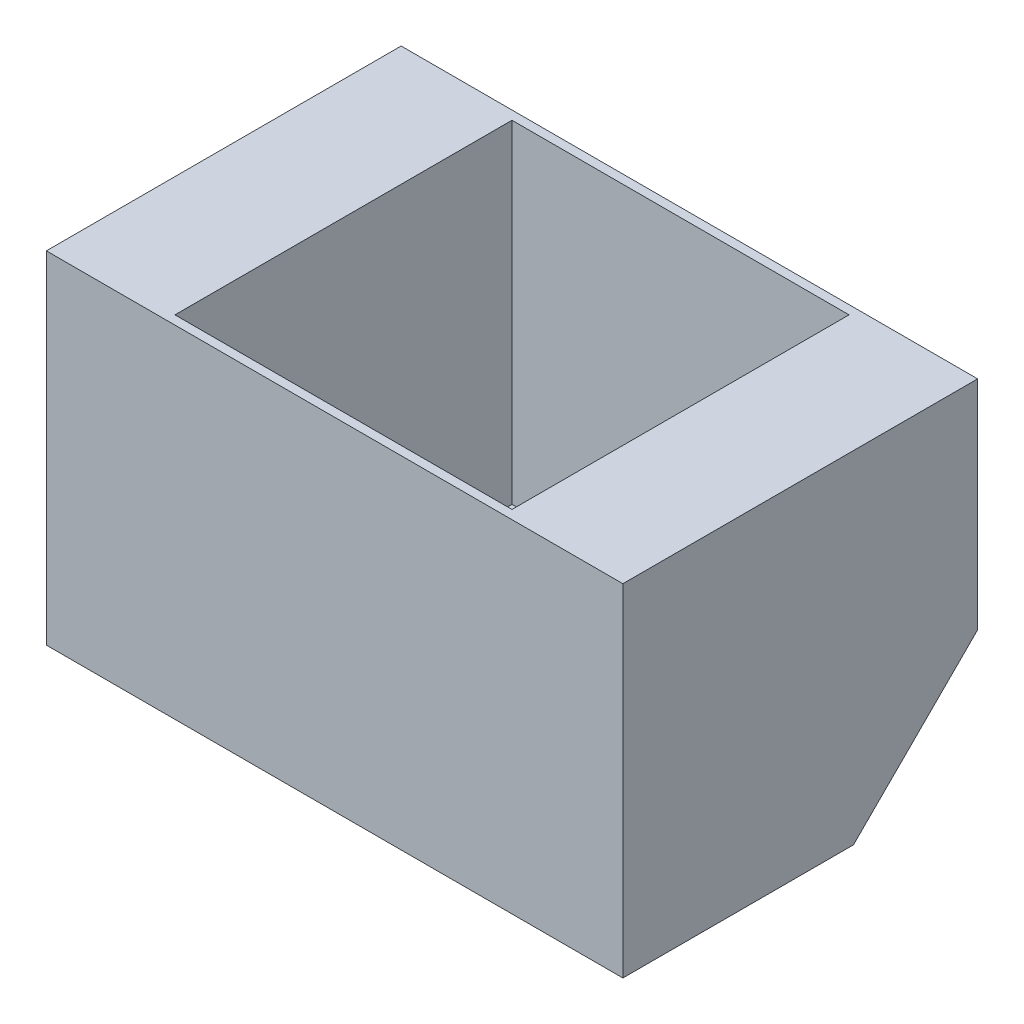
ISO-10303-21;
HEADER;
FILE_DESCRIPTION(('STEP AP214'),'2;1');
FILE_NAME('part.step','',(''),(''),'','','');
FILE_SCHEMA(('AUTOMOTIVE_DESIGN { 1 0 10303 214 1 1 1 1 }'));
ENDSEC;
DATA;
#1=APPLICATION_CONTEXT('core data for automotive mechanical design processes');
#2=APPLICATION_PROTOCOL_DEFINITION('international standard','automotive_design',2000,#1);
#3=PRODUCT_CONTEXT('',#1,'mechanical');
#4=PRODUCT('Part','Part','',(#3));
#5=PRODUCT_RELATED_PRODUCT_CATEGORY('part','',(#4));
#6=PRODUCT_DEFINITION_FORMATION('','',#4);
#7=PRODUCT_DEFINITION_CONTEXT('part definition',#1,'design');
#8=PRODUCT_DEFINITION('design','',#6,#7);
#9=PRODUCT_DEFINITION_SHAPE('','',#8);
#10=(LENGTH_UNIT() NAMED_UNIT(*) SI_UNIT(.MILLI.,.METRE.));
#11=(NAMED_UNIT(*) PLANE_ANGLE_UNIT() SI_UNIT($,.RADIAN.));
#12=(NAMED_UNIT(*) SI_UNIT($,.STERADIAN.) SOLID_ANGLE_UNIT());
#13=UNCERTAINTY_MEASURE_WITH_UNIT(LENGTH_MEASURE(1.E-05),#10,'distance_accuracy_value','');
#14=(GEOMETRIC_REPRESENTATION_CONTEXT(3) GLOBAL_UNCERTAINTY_ASSIGNED_CONTEXT((#13)) GLOBAL_UNIT_ASSIGNED_CONTEXT((#10,
#11,#12)) REPRESENTATION_CONTEXT('',''));
#15=CARTESIAN_POINT('',(0.,0.,0.));
#16=DIRECTION('',(0.,0.,1.));
#17=DIRECTION('',(1.,0.,0.));
#18=AXIS2_PLACEMENT_3D('',#15,#16,#17);
#19=CARTESIAN_POINT('',(0.,0.,0.));
#20=DIRECTION('',(0.,1.,0.));
#21=DIRECTION('',(0.,0.,1.));
#22=AXIS2_PLACEMENT_3D('',#19,#20,#21);
#23=PLANE('',#22);
#24=CARTESIAN_POINT('',(0.,0.,0.));
#25=DIRECTION('',(0.,1.,0.));
#26=DIRECTION('',(0.,0.,1.));
#27=AXIS2_PLACEMENT_3D('',#24,#25,#26);
#28=CIRCLE('',#27,18.4);
#29=CARTESIAN_POINT('',(0.,0.,18.4));
#30=VERTEX_POINT('',#29);
#31=EDGE_CURVE('E165',#30,#30,#28,.T.);
#32=ORIENTED_EDGE('',*,*,#31,.T.);
#33=EDGE_LOOP('',(#32));
#34=FACE_BOUND('',#33,.T.);
#35=CARTESIAN_POINT('',(24.,0.,-24.));
#36=DIRECTION('',(0.,1.,0.));
#37=DIRECTION('',(0.,0.,1.));
#38=AXIS2_PLACEMENT_3D('',#35,#36,#37);
#39=CIRCLE('',#38,2.2);
#40=CARTESIAN_POINT('',(24.,0.,-21.8));
#41=VERTEX_POINT('',#40);
#42=EDGE_CURVE('E169',#41,#41,#39,.T.);
#43=ORIENTED_EDGE('',*,*,#42,.T.);
#44=EDGE_LOOP('',(#43));
#45=FACE_BOUND('',#44,.T.);
#46=CARTESIAN_POINT('',(-24.,0.,-24.));
#47=DIRECTION('',(0.,1.,0.));
#48=DIRECTION('',(0.,0.,1.));
#49=AXIS2_PLACEMENT_3D('',#46,#47,#48);
#50=CIRCLE('',#49,2.2);
#51=CARTESIAN_POINT('',(-24.,0.,-21.8));
#52=VERTEX_POINT('',#51);
#53=EDGE_CURVE('E173',#52,#52,#50,.T.);
#54=ORIENTED_EDGE('',*,*,#53,.T.);
#55=EDGE_LOOP('',(#54));
#56=FACE_BOUND('',#55,.T.);
#57=CARTESIAN_POINT('',(24.,0.,24.));
#58=DIRECTION('',(0.,1.,0.));
#59=DIRECTION('',(0.,0.,1.));
#60=AXIS2_PLACEMENT_3D('',#57,#58,#59);
#61=CIRCLE('',#60,2.2);
#62=CARTESIAN_POINT('',(24.,0.,26.2));
#63=VERTEX_POINT('',#62);
#64=EDGE_CURVE('E177',#63,#63,#61,.F.);
#65=ORIENTED_EDGE('',*,*,#64,.F.);
#66=EDGE_LOOP('',(#65));
#67=FACE_BOUND('',#66,.T.);
#68=CARTESIAN_POINT('',(-24.,0.,24.));
#69=DIRECTION('',(0.,1.,0.));
#70=DIRECTION('',(0.,0.,1.));
#71=AXIS2_PLACEMENT_3D('',#68,#69,#70);
#72=CIRCLE('',#71,2.2);
#73=CARTESIAN_POINT('',(-24.,0.,26.2));
#74=VERTEX_POINT('',#73);
#75=EDGE_CURVE('E51',#74,#74,#72,.F.);
#76=ORIENTED_EDGE('',*,*,#75,.F.);
#77=EDGE_LOOP('',(#76));
#78=FACE_BOUND('',#77,.T.);
#79=DIRECTION('',(-1.,0.,0.));
#80=VECTOR('',#79,1.);
#81=CARTESIAN_POINT('',(-44.0000000000001,0.,-12.));
#82=LINE('',#81,#80);
#83=CARTESIAN_POINT('',(-44.0000000000001,0.,-12.));
#84=VERTEX_POINT('',#83);
#85=CARTESIAN_POINT('',(-65.,0.,-12.));
#86=VERTEX_POINT('',#85);
#87=EDGE_CURVE('E65',#84,#86,#82,.T.);
#88=ORIENTED_EDGE('',*,*,#87,.F.);
#89=DIRECTION('',(0.,0.,-1.));
#90=VECTOR('',#89,1.);
#91=CARTESIAN_POINT('',(-44.0000000000001,0.,0.));
#92=LINE('',#91,#90);
#93=CARTESIAN_POINT('',(-44.0000000000001,0.,-40.));
#94=VERTEX_POINT('',#93);
#95=EDGE_CURVE('E142',#84,#94,#92,.T.);
#96=ORIENTED_EDGE('',*,*,#95,.T.);
#97=DIRECTION('',(-1.,0.,0.));
#98=VECTOR('',#97,1.);
#99=CARTESIAN_POINT('',(-40.,0.,-40.));
#100=LINE('',#99,#98);
#101=CARTESIAN_POINT('',(44.0000000000001,0.,-40.));
#102=VERTEX_POINT('',#101);
#103=EDGE_CURVE('E57',#102,#94,#100,.T.);
#104=ORIENTED_EDGE('',*,*,#103,.F.);
#105=DIRECTION('',(0.,0.,-1.));
#106=VECTOR('',#105,1.);
#107=CARTESIAN_POINT('',(44.0000000000001,0.,0.));
#108=LINE('',#107,#106);
#109=CARTESIAN_POINT('',(44.0000000000001,0.,-12.));
#110=VERTEX_POINT('',#109);
#111=EDGE_CURVE('E370',#110,#102,#108,.T.);
#112=ORIENTED_EDGE('',*,*,#111,.F.);
#113=DIRECTION('',(1.,0.,0.));
#114=VECTOR('',#113,1.);
#115=CARTESIAN_POINT('',(44.0000000000001,0.,-12.));
#116=LINE('',#115,#114);
#117=CARTESIAN_POINT('',(65.,0.,-12.));
#118=VERTEX_POINT('',#117);
#119=EDGE_CURVE('E279',#110,#118,#116,.T.);
#120=ORIENTED_EDGE('',*,*,#119,.T.);
#121=DIRECTION('',(0.,0.,1.));
#122=VECTOR('',#121,1.);
#123=CARTESIAN_POINT('',(65.,0.,-40.));
#124=LINE('',#123,#122);
#125=CARTESIAN_POINT('',(65.,0.,40.));
#126=VERTEX_POINT('',#125);
#127=EDGE_CURVE('E274',#118,#126,#124,.T.);
#128=ORIENTED_EDGE('',*,*,#127,.T.);
#129=DIRECTION('',(1.,0.,0.));
#130=VECTOR('',#129,1.);
#131=CARTESIAN_POINT('',(-40.,0.,40.));
#132=LINE('',#131,#130);
#133=CARTESIAN_POINT('',(-65.,0.,40.));
#134=VERTEX_POINT('',#133);
#135=EDGE_CURVE('E11',#134,#126,#132,.T.);
#136=ORIENTED_EDGE('',*,*,#135,.F.);
#137=DIRECTION('',(0.,0.,1.));
#138=VECTOR('',#137,1.);
#139=CARTESIAN_POINT('',(-65.,0.,-40.));
#140=LINE('',#139,#138);
#141=EDGE_CURVE('E298',#86,#134,#140,.T.);
#142=ORIENTED_EDGE('',*,*,#141,.F.);
#143=EDGE_LOOP('',(#88,#96,#104,#112,#120,#128,#136,#142));
#144=FACE_BOUND('',#143,.T.);
#145=ADVANCED_FACE('F47',(#34,#45,#56,#67,#78,#144),#23,.F.);
#146=CARTESIAN_POINT('',(-40.,2.,-40.));
#147=DIRECTION('',(0.,0.,1.));
#148=DIRECTION('',(1.,0.,0.));
#149=AXIS2_PLACEMENT_3D('',#146,#147,#148);
#150=PLANE('',#149);
#151=DIRECTION('',(-1.,0.,0.));
#152=VECTOR('',#151,1.);
#153=CARTESIAN_POINT('',(-44.0000000000001,28.,-40.));
#154=LINE('',#153,#152);
#155=CARTESIAN_POINT('',(-44.0000000000001,28.,-40.));
#156=VERTEX_POINT('',#155);
#157=CARTESIAN_POINT('',(-65.,28.,-40.));
#158=VERTEX_POINT('',#157);
#159=EDGE_CURVE('E358',#156,#158,#154,.T.);
#160=ORIENTED_EDGE('',*,*,#159,.T.);
#161=DIRECTION('',(0.,1.,0.));
#162=VECTOR('',#161,1.);
#163=CARTESIAN_POINT('',(-65.,0.,-40.));
#164=LINE('',#163,#162);
#165=CARTESIAN_POINT('',(-65.,77.,-40.));
#166=VERTEX_POINT('',#165);
#167=EDGE_CURVE('E292',#158,#166,#164,.T.);
#168=ORIENTED_EDGE('',*,*,#167,.T.);
#169=DIRECTION('',(-1.,0.,0.));
#170=VECTOR('',#169,1.);
#171=CARTESIAN_POINT('',(-40.,77.,-40.));
#172=LINE('',#171,#170);
#173=CARTESIAN_POINT('',(65.,77.,-40.));
#174=VERTEX_POINT('',#173);
#175=EDGE_CURVE('E194',#174,#166,#172,.T.);
#176=ORIENTED_EDGE('',*,*,#175,.F.);
#177=DIRECTION('',(0.,1.,0.));
#178=VECTOR('',#177,1.);
#179=CARTESIAN_POINT('',(65.,0.,-40.));
#180=LINE('',#179,#178);
#181=CARTESIAN_POINT('',(65.,28.,-40.));
#182=VERTEX_POINT('',#181);
#183=EDGE_CURVE('E278',#182,#174,#180,.T.);
#184=ORIENTED_EDGE('',*,*,#183,.F.);
#185=DIRECTION('',(1.,0.,0.));
#186=VECTOR('',#185,1.);
#187=CARTESIAN_POINT('',(44.0000000000001,28.,-40.));
#188=LINE('',#187,#186);
#189=CARTESIAN_POINT('',(44.0000000000001,28.,-40.));
#190=VERTEX_POINT('',#189);
#191=EDGE_CURVE('E73',#190,#182,#188,.T.);
#192=ORIENTED_EDGE('',*,*,#191,.F.);
#193=DIRECTION('',(0.,1.,0.));
#194=VECTOR('',#193,1.);
#195=CARTESIAN_POINT('',(44.0000000000001,0.,-40.));
#196=LINE('',#195,#194);
#197=EDGE_CURVE('E159',#102,#190,#196,.T.);
#198=ORIENTED_EDGE('',*,*,#197,.F.);
#199=ORIENTED_EDGE('',*,*,#103,.T.);
#200=DIRECTION('',(0.,1.,0.));
#201=VECTOR('',#200,1.);
#202=CARTESIAN_POINT('',(-44.0000000000001,0.,-40.));
#203=LINE('',#202,#201);
#204=EDGE_CURVE('E139',#94,#156,#203,.T.);
#205=ORIENTED_EDGE('',*,*,#204,.T.);
#206=EDGE_LOOP('',(#160,#168,#176,#184,#192,#198,#199,#205));
#207=FACE_BOUND('',#206,.T.);
#208=ADVANCED_FACE('F49',(#207),#150,.F.);
#209=CARTESIAN_POINT('',(-65.,0.,-40.));
#210=DIRECTION('',(1.,0.,0.));
#211=DIRECTION('',(0.,0.,-1.));
#212=AXIS2_PLACEMENT_3D('',#209,#210,#211);
#213=PLANE('',#212);
#214=DIRECTION('',(0.,-0.707106781186548,0.707106781186547));
#215=VECTOR('',#214,1.);
#216=CARTESIAN_POINT('',(-65.,-6.00000000000001,-6.));
#217=LINE('',#216,#215);
#218=EDGE_CURVE('E149',#158,#86,#217,.T.);
#219=ORIENTED_EDGE('',*,*,#218,.T.);
#220=ORIENTED_EDGE('',*,*,#141,.T.);
#221=DIRECTION('',(0.,1.,0.));
#222=VECTOR('',#221,1.);
#223=CARTESIAN_POINT('',(-65.,0.,40.));
#224=LINE('',#223,#222);
#225=CARTESIAN_POINT('',(-65.,77.,40.));
#226=VERTEX_POINT('',#225);
#227=EDGE_CURVE('E269',#134,#226,#224,.T.);
#228=ORIENTED_EDGE('',*,*,#227,.T.);
#229=DIRECTION('',(0.,0.,1.));
#230=VECTOR('',#229,1.);
#231=CARTESIAN_POINT('',(-65.,77.,-40.));
#232=LINE('',#231,#230);
#233=EDGE_CURVE('E295',#166,#226,#232,.T.);
#234=ORIENTED_EDGE('',*,*,#233,.F.);
#235=ORIENTED_EDGE('',*,*,#167,.F.);
#236=EDGE_LOOP('',(#219,#220,#228,#234,#235));
#237=FACE_BOUND('',#236,.T.);
#238=ADVANCED_FACE('F213',(#237),#213,.F.);
#239=CARTESIAN_POINT('',(0.,2.,0.));
#240=DIRECTION('',(0.,1.,0.));
#241=DIRECTION('',(0.,0.,1.));
#242=AXIS2_PLACEMENT_3D('',#239,#240,#241);
#243=PLANE('',#242);
#244=DIRECTION('',(0.,0.,1.));
#245=VECTOR('',#244,1.);
#246=CARTESIAN_POINT('',(-38.,2.,-38.));
#247=LINE('',#246,#245);
#248=CARTESIAN_POINT('',(-38.,2.,-38.));
#249=VERTEX_POINT('',#248);
#250=CARTESIAN_POINT('',(-38.,2.,38.));
#251=VERTEX_POINT('',#250);
#252=EDGE_CURVE('E301',#249,#251,#247,.T.);
#253=ORIENTED_EDGE('',*,*,#252,.T.);
#254=DIRECTION('',(1.,0.,0.));
#255=VECTOR('',#254,1.);
#256=CARTESIAN_POINT('',(38.,2.,38.));
#257=LINE('',#256,#255);
#258=CARTESIAN_POINT('',(38.,2.,38.));
#259=VERTEX_POINT('',#258);
#260=EDGE_CURVE('E322',#251,#259,#257,.T.);
#261=ORIENTED_EDGE('',*,*,#260,.T.);
#262=DIRECTION('',(0.,0.,-1.));
#263=VECTOR('',#262,1.);
#264=CARTESIAN_POINT('',(38.,2.,-38.));
#265=LINE('',#264,#263);
#266=CARTESIAN_POINT('',(38.,2.,-38.));
#267=VERTEX_POINT('',#266);
#268=EDGE_CURVE('E325',#259,#267,#265,.T.);
#269=ORIENTED_EDGE('',*,*,#268,.T.);
#270=DIRECTION('',(-1.,0.,0.));
#271=VECTOR('',#270,1.);
#272=CARTESIAN_POINT('',(38.,2.,-38.));
#273=LINE('',#272,#271);
#274=EDGE_CURVE('E309',#267,#249,#273,.T.);
#275=ORIENTED_EDGE('',*,*,#274,.T.);
#276=EDGE_LOOP('',(#253,#261,#269,#275));
#277=FACE_BOUND('',#276,.T.);
#278=CARTESIAN_POINT('',(-24.,2.,24.));
#279=DIRECTION('',(0.,-1.,0.));
#280=DIRECTION('',(0.,0.,-1.));
#281=AXIS2_PLACEMENT_3D('',#278,#279,#280);
#282=CIRCLE('',#281,2.2);
#283=CARTESIAN_POINT('',(-24.,2.,26.2));
#284=VERTEX_POINT('',#283);
#285=EDGE_CURVE('E180',#284,#284,#282,.T.);
#286=ORIENTED_EDGE('',*,*,#285,.T.);
#287=EDGE_LOOP('',(#286));
#288=FACE_BOUND('',#287,.T.);
#289=CARTESIAN_POINT('',(24.,2.,24.));
#290=DIRECTION('',(0.,-1.,0.));
#291=DIRECTION('',(0.,0.,-1.));
#292=AXIS2_PLACEMENT_3D('',#289,#290,#291);
#293=CIRCLE('',#292,2.2);
#294=CARTESIAN_POINT('',(24.,2.,26.2));
#295=VERTEX_POINT('',#294);
#296=EDGE_CURVE('E188',#295,#295,#293,.T.);
#297=ORIENTED_EDGE('',*,*,#296,.T.);
#298=EDGE_LOOP('',(#297));
#299=FACE_BOUND('',#298,.T.);
#300=CARTESIAN_POINT('',(-24.,2.,-24.));
#301=DIRECTION('',(0.,1.,0.));
#302=DIRECTION('',(0.,0.,1.));
#303=AXIS2_PLACEMENT_3D('',#300,#301,#302);
#304=CIRCLE('',#303,2.2);
#305=CARTESIAN_POINT('',(-24.,2.,-21.8));
#306=VERTEX_POINT('',#305);
#307=EDGE_CURVE('E174',#306,#306,#304,.T.);
#308=ORIENTED_EDGE('',*,*,#307,.F.);
#309=EDGE_LOOP('',(#308));
#310=FACE_BOUND('',#309,.T.);
#311=CARTESIAN_POINT('',(24.,2.,-24.));
#312=DIRECTION('',(0.,1.,0.));
#313=DIRECTION('',(0.,0.,1.));
#314=AXIS2_PLACEMENT_3D('',#311,#312,#313);
#315=CIRCLE('',#314,2.2);
#316=CARTESIAN_POINT('',(24.,2.,-21.8));
#317=VERTEX_POINT('',#316);
#318=EDGE_CURVE('E186',#317,#317,#315,.T.);
#319=ORIENTED_EDGE('',*,*,#318,.F.);
#320=EDGE_LOOP('',(#319));
#321=FACE_BOUND('',#320,.T.);
#322=CARTESIAN_POINT('',(0.,2.,0.));
#323=DIRECTION('',(0.,1.,0.));
#324=DIRECTION('',(0.,0.,1.));
#325=AXIS2_PLACEMENT_3D('',#322,#323,#324);
#326=CIRCLE('',#325,18.4);
#327=CARTESIAN_POINT('',(0.,2.,18.4));
#328=VERTEX_POINT('',#327);
#329=EDGE_CURVE('E161',#328,#328,#326,.T.);
#330=ORIENTED_EDGE('',*,*,#329,.F.);
#331=EDGE_LOOP('',(#330));
#332=FACE_BOUND('',#331,.T.);
#333=ADVANCED_FACE('F209',(#277,#288,#299,#310,#321,#332),#243,.T.);
#334=CARTESIAN_POINT('',(-40.,2.,40.));
#335=DIRECTION('',(0.,0.,-1.));
#336=DIRECTION('',(-1.,0.,0.));
#337=AXIS2_PLACEMENT_3D('',#334,#335,#336);
#338=PLANE('',#337);
#339=ORIENTED_EDGE('',*,*,#135,.T.);
#340=DIRECTION('',(0.,1.,0.));
#341=VECTOR('',#340,1.);
#342=CARTESIAN_POINT('',(65.,0.,40.));
#343=LINE('',#342,#341);
#344=CARTESIAN_POINT('',(65.,77.,40.));
#345=VERTEX_POINT('',#344);
#346=EDGE_CURVE('E267',#126,#345,#343,.T.);
#347=ORIENTED_EDGE('',*,*,#346,.T.);
#348=DIRECTION('',(1.,0.,0.));
#349=VECTOR('',#348,1.);
#350=CARTESIAN_POINT('',(-40.,77.,40.));
#351=LINE('',#350,#349);
#352=EDGE_CURVE('E344',#226,#345,#351,.T.);
#353=ORIENTED_EDGE('',*,*,#352,.F.);
#354=ORIENTED_EDGE('',*,*,#227,.F.);
#355=EDGE_LOOP('',(#339,#347,#353,#354));
#356=FACE_BOUND('',#355,.T.);
#357=ADVANCED_FACE('F212',(#356),#338,.F.);
#358=CARTESIAN_POINT('',(0.,2.,0.));
#359=DIRECTION('',(0.,-1.,0.));
#360=DIRECTION('',(0.,0.,-1.));
#361=AXIS2_PLACEMENT_3D('',#358,#359,#360);
#362=CYLINDRICAL_SURFACE('',#361,18.4);
#363=ORIENTED_EDGE('',*,*,#329,.T.);
#364=EDGE_LOOP('',(#363));
#365=FACE_BOUND('',#364,.T.);
#366=ORIENTED_EDGE('',*,*,#31,.F.);
#367=EDGE_LOOP('',(#366));
#368=FACE_BOUND('',#367,.T.);
#369=ADVANCED_FACE('F218',(#365,#368),#362,.F.);
#370=CARTESIAN_POINT('',(24.,-13.25,-24.));
#371=DIRECTION('',(0.,1.,0.));
#372=DIRECTION('',(0.,0.,1.));
#373=AXIS2_PLACEMENT_3D('',#370,#371,#372);
#374=CYLINDRICAL_SURFACE('',#373,2.2);
#375=CARTESIAN_POINT('',(24.,2.,-21.8));
#376=CARTESIAN_POINT('',(24.,1.97916666666667,-21.8));
#377=CARTESIAN_POINT('',(24.,1.95833333333333,-21.8));
#378=CARTESIAN_POINT('',(24.,1.91666666666666,-21.8));
#379=CARTESIAN_POINT('',(24.,1.89583333333333,-21.8));
#380=CARTESIAN_POINT('',(24.,1.85416666666666,-21.8));
#381=CARTESIAN_POINT('',(24.,1.83333333333333,-21.8));
#382=CARTESIAN_POINT('',(24.,1.79166666666666,-21.8));
#383=CARTESIAN_POINT('',(24.,1.77083333333333,-21.8));
#384=CARTESIAN_POINT('',(24.,1.72916666666666,-21.8));
#385=CARTESIAN_POINT('',(24.,1.70833333333333,-21.8));
#386=CARTESIAN_POINT('',(24.,1.66666666666666,-21.8));
#387=CARTESIAN_POINT('',(24.,1.64583333333333,-21.8));
#388=CARTESIAN_POINT('',(24.,1.60416666666666,-21.8));
#389=CARTESIAN_POINT('',(24.,1.58333333333333,-21.8));
#390=CARTESIAN_POINT('',(24.,1.54166666666666,-21.8));
#391=CARTESIAN_POINT('',(24.,1.52083333333333,-21.8));
#392=CARTESIAN_POINT('',(24.,1.47916666666667,-21.8));
#393=CARTESIAN_POINT('',(24.,1.45833333333333,-21.8));
#394=CARTESIAN_POINT('',(24.,1.41666666666667,-21.8));
#395=CARTESIAN_POINT('',(24.,1.39583333333333,-21.8));
#396=CARTESIAN_POINT('',(24.,1.35416666666667,-21.8));
#397=CARTESIAN_POINT('',(24.,1.33333333333333,-21.8));
#398=CARTESIAN_POINT('',(24.,1.29166666666667,-21.8));
#399=CARTESIAN_POINT('',(24.,1.27083333333333,-21.8));
#400=CARTESIAN_POINT('',(24.,1.22916666666667,-21.8));
#401=CARTESIAN_POINT('',(24.,1.20833333333333,-21.8));
#402=CARTESIAN_POINT('',(24.,1.16666666666667,-21.8));
#403=CARTESIAN_POINT('',(24.,1.14583333333333,-21.8));
#404=CARTESIAN_POINT('',(24.,1.10416666666667,-21.8));
#405=CARTESIAN_POINT('',(24.,1.08333333333333,-21.8));
#406=CARTESIAN_POINT('',(24.,1.04166666666667,-21.8));
#407=CARTESIAN_POINT('',(24.,1.02083333333333,-21.8));
#408=CARTESIAN_POINT('',(24.,0.979166666666666,-21.8));
#409=CARTESIAN_POINT('',(24.,0.958333333333332,-21.8));
#410=CARTESIAN_POINT('',(24.,0.916666666666666,-21.8));
#411=CARTESIAN_POINT('',(24.,0.895833333333332,-21.8));
#412=CARTESIAN_POINT('',(24.,0.854166666666666,-21.8));
#413=CARTESIAN_POINT('',(24.,0.833333333333332,-21.8));
#414=CARTESIAN_POINT('',(24.,0.791666666666666,-21.8));
#415=CARTESIAN_POINT('',(24.,0.770833333333332,-21.8));
#416=CARTESIAN_POINT('',(24.,0.729166666666666,-21.8));
#417=CARTESIAN_POINT('',(24.,0.708333333333332,-21.8));
#418=CARTESIAN_POINT('',(24.,0.666666666666666,-21.8));
#419=CARTESIAN_POINT('',(24.,0.645833333333332,-21.8));
#420=CARTESIAN_POINT('',(24.,0.604166666666666,-21.8));
#421=CARTESIAN_POINT('',(24.,0.583333333333333,-21.8));
#422=CARTESIAN_POINT('',(24.,0.541666666666667,-21.8));
#423=CARTESIAN_POINT('',(24.,0.520833333333334,-21.8));
#424=CARTESIAN_POINT('',(24.,0.479166666666667,-21.8));
#425=CARTESIAN_POINT('',(24.,0.458333333333334,-21.8));
#426=CARTESIAN_POINT('',(24.,0.416666666666667,-21.8));
#427=CARTESIAN_POINT('',(24.,0.395833333333334,-21.8));
#428=CARTESIAN_POINT('',(24.,0.354166666666667,-21.8));
#429=CARTESIAN_POINT('',(24.,0.333333333333334,-21.8));
#430=CARTESIAN_POINT('',(24.,0.291666666666667,-21.8));
#431=CARTESIAN_POINT('',(24.,0.270833333333334,-21.8));
#432=CARTESIAN_POINT('',(24.,0.229166666666667,-21.8));
#433=CARTESIAN_POINT('',(24.,0.208333333333334,-21.8));
#434=CARTESIAN_POINT('',(24.,0.166666666666667,-21.8));
#435=CARTESIAN_POINT('',(24.,0.145833333333333,-21.8));
#436=CARTESIAN_POINT('',(24.,0.104166666666667,-21.8));
#437=CARTESIAN_POINT('',(24.,0.0833333333333334,-21.8));
#438=CARTESIAN_POINT('',(24.,0.0416666666666667,-21.8));
#439=CARTESIAN_POINT('',(24.,0.0208333333333333,-21.8));
#440=CARTESIAN_POINT('',(24.,0.,-21.8));
#441=B_SPLINE_CURVE_WITH_KNOTS('',3,(#375,#376,#377,#378,#379,#380,#381,#382,#383,#384,#385,
#386,#387,#388,#389,#390,#391,#392,#393,#394,#395,#396,#397,#398,#399,#400,#401,#402,#403,#404,
#405,#406,#407,#408,#409,#410,#411,#412,#413,#414,#415,#416,#417,#418,#419,#420,#421,#422,#423,
#424,#425,#426,#427,#428,#429,#430,#431,#432,#433,#434,#435,#436,#437,#438,#439,#440),
.UNSPECIFIED.,.F.,.F.,(4,2,2,2,2,2,2,2,2,2,2,2,2,2,2,2,2,2,2,2,2,2,2,2,2,2,2,2,2,2,2,2,4),(0.,
0.0625000000000001,0.125,0.1875,0.25,0.3125,0.375,0.4375,0.5,0.562499999999999,
0.624999999999999,0.687499999999999,0.749999999999999,0.812499999999999,0.874999999999999,
0.937499999999999,0.999999999999999,1.0625,1.125,1.1875,1.25,1.3125,1.375,1.4375,1.5,1.5625,
1.625,1.6875,1.75,1.8125,1.875,1.9375,2.),.UNSPECIFIED.);
#442=EDGE_CURVE('BSEAM206',#317,#41,#441,.T.);
#443=ORIENTED_EDGE('',*,*,#318,.T.);
#444=ORIENTED_EDGE('',*,*,#42,.F.);
#445=ORIENTED_EDGE('',*,*,#442,.T.);
#446=ORIENTED_EDGE('',*,*,#442,.F.);
#447=EDGE_LOOP('',(#443,#445,#444,#446));
#448=FACE_BOUND('',#447,.T.);
#449=ADVANCED_FACE('F206',(#448),#374,.F.);
#450=CARTESIAN_POINT('',(-24.,-13.25,-24.));
#451=DIRECTION('',(0.,1.,0.));
#452=DIRECTION('',(0.,0.,1.));
#453=AXIS2_PLACEMENT_3D('',#450,#451,#452);
#454=CYLINDRICAL_SURFACE('',#453,2.2);
#455=CARTESIAN_POINT('',(-24.,2.,-21.8));
#456=CARTESIAN_POINT('',(-24.,1.97916666666667,-21.8));
#457=CARTESIAN_POINT('',(-24.,1.95833333333333,-21.8));
#458=CARTESIAN_POINT('',(-24.,1.91666666666666,-21.8));
#459=CARTESIAN_POINT('',(-24.,1.89583333333333,-21.8));
#460=CARTESIAN_POINT('',(-24.,1.85416666666666,-21.8));
#461=CARTESIAN_POINT('',(-24.,1.83333333333333,-21.8));
#462=CARTESIAN_POINT('',(-24.,1.79166666666666,-21.8));
#463=CARTESIAN_POINT('',(-24.,1.77083333333333,-21.8));
#464=CARTESIAN_POINT('',(-24.,1.72916666666666,-21.8));
#465=CARTESIAN_POINT('',(-24.,1.70833333333333,-21.8));
#466=CARTESIAN_POINT('',(-24.,1.66666666666666,-21.8));
#467=CARTESIAN_POINT('',(-24.,1.64583333333333,-21.8));
#468=CARTESIAN_POINT('',(-24.,1.60416666666666,-21.8));
#469=CARTESIAN_POINT('',(-24.,1.58333333333333,-21.8));
#470=CARTESIAN_POINT('',(-24.,1.54166666666666,-21.8));
#471=CARTESIAN_POINT('',(-24.,1.52083333333333,-21.8));
#472=CARTESIAN_POINT('',(-24.,1.47916666666667,-21.8));
#473=CARTESIAN_POINT('',(-24.,1.45833333333333,-21.8));
#474=CARTESIAN_POINT('',(-24.,1.41666666666667,-21.8));
#475=CARTESIAN_POINT('',(-24.,1.39583333333333,-21.8));
#476=CARTESIAN_POINT('',(-24.,1.35416666666667,-21.8));
#477=CARTESIAN_POINT('',(-24.,1.33333333333333,-21.8));
#478=CARTESIAN_POINT('',(-24.,1.29166666666667,-21.8));
#479=CARTESIAN_POINT('',(-24.,1.27083333333333,-21.8));
#480=CARTESIAN_POINT('',(-24.,1.22916666666667,-21.8));
#481=CARTESIAN_POINT('',(-24.,1.20833333333333,-21.8));
#482=CARTESIAN_POINT('',(-24.,1.16666666666667,-21.8));
#483=CARTESIAN_POINT('',(-24.,1.14583333333333,-21.8));
#484=CARTESIAN_POINT('',(-24.,1.10416666666667,-21.8));
#485=CARTESIAN_POINT('',(-24.,1.08333333333333,-21.8));
#486=CARTESIAN_POINT('',(-24.,1.04166666666667,-21.8));
#487=CARTESIAN_POINT('',(-24.,1.02083333333333,-21.8));
#488=CARTESIAN_POINT('',(-24.,0.979166666666666,-21.8));
#489=CARTESIAN_POINT('',(-24.,0.958333333333332,-21.8));
#490=CARTESIAN_POINT('',(-24.,0.916666666666666,-21.8));
#491=CARTESIAN_POINT('',(-24.,0.895833333333332,-21.8));
#492=CARTESIAN_POINT('',(-24.,0.854166666666666,-21.8));
#493=CARTESIAN_POINT('',(-24.,0.833333333333332,-21.8));
#494=CARTESIAN_POINT('',(-24.,0.791666666666666,-21.8));
#495=CARTESIAN_POINT('',(-24.,0.770833333333332,-21.8));
#496=CARTESIAN_POINT('',(-24.,0.729166666666666,-21.8));
#497=CARTESIAN_POINT('',(-24.,0.708333333333332,-21.8));
#498=CARTESIAN_POINT('',(-24.,0.666666666666666,-21.8));
#499=CARTESIAN_POINT('',(-24.,0.645833333333332,-21.8));
#500=CARTESIAN_POINT('',(-24.,0.604166666666666,-21.8));
#501=CARTESIAN_POINT('',(-24.,0.583333333333333,-21.8));
#502=CARTESIAN_POINT('',(-24.,0.541666666666667,-21.8));
#503=CARTESIAN_POINT('',(-24.,0.520833333333334,-21.8));
#504=CARTESIAN_POINT('',(-24.,0.479166666666667,-21.8));
#505=CARTESIAN_POINT('',(-24.,0.458333333333334,-21.8));
#506=CARTESIAN_POINT('',(-24.,0.416666666666667,-21.8));
#507=CARTESIAN_POINT('',(-24.,0.395833333333334,-21.8));
#508=CARTESIAN_POINT('',(-24.,0.354166666666667,-21.8));
#509=CARTESIAN_POINT('',(-24.,0.333333333333334,-21.8));
#510=CARTESIAN_POINT('',(-24.,0.291666666666667,-21.8));
#511=CARTESIAN_POINT('',(-24.,0.270833333333334,-21.8));
#512=CARTESIAN_POINT('',(-24.,0.229166666666667,-21.8));
#513=CARTESIAN_POINT('',(-24.,0.208333333333334,-21.8));
#514=CARTESIAN_POINT('',(-24.,0.166666666666667,-21.8));
#515=CARTESIAN_POINT('',(-24.,0.145833333333333,-21.8));
#516=CARTESIAN_POINT('',(-24.,0.104166666666667,-21.8));
#517=CARTESIAN_POINT('',(-24.,0.0833333333333334,-21.8));
#518=CARTESIAN_POINT('',(-24.,0.0416666666666667,-21.8));
#519=CARTESIAN_POINT('',(-24.,0.0208333333333333,-21.8));
#520=CARTESIAN_POINT('',(-24.,0.,-21.8));
#521=B_SPLINE_CURVE_WITH_KNOTS('',3,(#455,#456,#457,#458,#459,#460,#461,#462,#463,#464,#465,
#466,#467,#468,#469,#470,#471,#472,#473,#474,#475,#476,#477,#478,#479,#480,#481,#482,#483,#484,
#485,#486,#487,#488,#489,#490,#491,#492,#493,#494,#495,#496,#497,#498,#499,#500,#501,#502,#503,
#504,#505,#506,#507,#508,#509,#510,#511,#512,#513,#514,#515,#516,#517,#518,#519,#520),
.UNSPECIFIED.,.F.,.F.,(4,2,2,2,2,2,2,2,2,2,2,2,2,2,2,2,2,2,2,2,2,2,2,2,2,2,2,2,2,2,2,2,4),(0.,
0.0625000000000001,0.125,0.1875,0.25,0.3125,0.375,0.4375,0.5,0.562499999999999,
0.624999999999999,0.687499999999999,0.749999999999999,0.812499999999999,0.874999999999999,
0.937499999999999,0.999999999999999,1.0625,1.125,1.1875,1.25,1.3125,1.375,1.4375,1.5,1.5625,
1.625,1.6875,1.75,1.8125,1.875,1.9375,2.),.UNSPECIFIED.);
#522=EDGE_CURVE('BSEAM249',#306,#52,#521,.T.);
#523=ORIENTED_EDGE('',*,*,#307,.T.);
#524=ORIENTED_EDGE('',*,*,#53,.F.);
#525=ORIENTED_EDGE('',*,*,#522,.T.);
#526=ORIENTED_EDGE('',*,*,#522,.F.);
#527=EDGE_LOOP('',(#523,#525,#524,#526));
#528=FACE_BOUND('',#527,.T.);
#529=ADVANCED_FACE('F249',(#528),#454,.F.);
#530=CARTESIAN_POINT('',(24.,-13.25,24.));
#531=DIRECTION('',(0.,1.,0.));
#532=DIRECTION('',(0.,0.,1.));
#533=AXIS2_PLACEMENT_3D('',#530,#531,#532);
#534=CYLINDRICAL_SURFACE('',#533,2.2);
#535=CARTESIAN_POINT('',(24.,2.,26.2));
#536=CARTESIAN_POINT('',(24.,1.97916666666667,26.2));
#537=CARTESIAN_POINT('',(24.,1.95833333333334,26.2));
#538=CARTESIAN_POINT('',(24.,1.91666666666667,26.2));
#539=CARTESIAN_POINT('',(24.,1.89583333333334,26.2));
#540=CARTESIAN_POINT('',(24.,1.85416666666667,26.2));
#541=CARTESIAN_POINT('',(24.,1.83333333333334,26.2));
#542=CARTESIAN_POINT('',(24.,1.79166666666667,26.2));
#543=CARTESIAN_POINT('',(24.,1.77083333333334,26.2));
#544=CARTESIAN_POINT('',(24.,1.72916666666667,26.2));
#545=CARTESIAN_POINT('',(24.,1.70833333333333,26.2));
#546=CARTESIAN_POINT('',(24.,1.66666666666667,26.2));
#547=CARTESIAN_POINT('',(24.,1.64583333333333,26.2));
#548=CARTESIAN_POINT('',(24.,1.60416666666667,26.2));
#549=CARTESIAN_POINT('',(24.,1.58333333333333,26.2));
#550=CARTESIAN_POINT('',(24.,1.54166666666667,26.2));
#551=CARTESIAN_POINT('',(24.,1.52083333333333,26.2));
#552=CARTESIAN_POINT('',(24.,1.47916666666667,26.2));
#553=CARTESIAN_POINT('',(24.,1.45833333333333,26.2));
#554=CARTESIAN_POINT('',(24.,1.41666666666667,26.2));
#555=CARTESIAN_POINT('',(24.,1.39583333333333,26.2));
#556=CARTESIAN_POINT('',(24.,1.35416666666667,26.2));
#557=CARTESIAN_POINT('',(24.,1.33333333333333,26.2));
#558=CARTESIAN_POINT('',(24.,1.29166666666667,26.2));
#559=CARTESIAN_POINT('',(24.,1.27083333333333,26.2));
#560=CARTESIAN_POINT('',(24.,1.22916666666667,26.2));
#561=CARTESIAN_POINT('',(24.,1.20833333333333,26.2));
#562=CARTESIAN_POINT('',(24.,1.16666666666667,26.2));
#563=CARTESIAN_POINT('',(24.,1.14583333333333,26.2));
#564=CARTESIAN_POINT('',(24.,1.10416666666667,26.2));
#565=CARTESIAN_POINT('',(24.,1.08333333333333,26.2));
#566=CARTESIAN_POINT('',(24.,1.04166666666667,26.2));
#567=CARTESIAN_POINT('',(24.,1.02083333333333,26.2));
#568=CARTESIAN_POINT('',(24.,0.979166666666668,26.2));
#569=CARTESIAN_POINT('',(24.,0.958333333333334,26.2));
#570=CARTESIAN_POINT('',(24.,0.916666666666668,26.2));
#571=CARTESIAN_POINT('',(24.,0.895833333333334,26.2));
#572=CARTESIAN_POINT('',(24.,0.854166666666667,26.2));
#573=CARTESIAN_POINT('',(24.,0.833333333333334,26.2));
#574=CARTESIAN_POINT('',(24.,0.791666666666667,26.2));
#575=CARTESIAN_POINT('',(24.,0.770833333333334,26.2));
#576=CARTESIAN_POINT('',(24.,0.729166666666667,26.2));
#577=CARTESIAN_POINT('',(24.,0.708333333333334,26.2));
#578=CARTESIAN_POINT('',(24.,0.666666666666667,26.2));
#579=CARTESIAN_POINT('',(24.,0.645833333333334,26.2));
#580=CARTESIAN_POINT('',(24.,0.604166666666667,26.2));
#581=CARTESIAN_POINT('',(24.,0.583333333333334,26.2));
#582=CARTESIAN_POINT('',(24.,0.541666666666667,26.2));
#583=CARTESIAN_POINT('',(24.,0.520833333333334,26.2));
#584=CARTESIAN_POINT('',(24.,0.479166666666667,26.2));
#585=CARTESIAN_POINT('',(24.,0.458333333333334,26.2));
#586=CARTESIAN_POINT('',(24.,0.416666666666667,26.2));
#587=CARTESIAN_POINT('',(24.,0.395833333333334,26.2));
#588=CARTESIAN_POINT('',(24.,0.354166666666667,26.2));
#589=CARTESIAN_POINT('',(24.,0.333333333333334,26.2));
#590=CARTESIAN_POINT('',(24.,0.291666666666667,26.2));
#591=CARTESIAN_POINT('',(24.,0.270833333333334,26.2));
#592=CARTESIAN_POINT('',(24.,0.229166666666667,26.2));
#593=CARTESIAN_POINT('',(24.,0.208333333333334,26.2));
#594=CARTESIAN_POINT('',(24.,0.166666666666667,26.2));
#595=CARTESIAN_POINT('',(24.,0.145833333333333,26.2));
#596=CARTESIAN_POINT('',(24.,0.104166666666667,26.2));
#597=CARTESIAN_POINT('',(24.,0.0833333333333334,26.2));
#598=CARTESIAN_POINT('',(24.,0.0416666666666667,26.2));
#599=CARTESIAN_POINT('',(24.,0.0208333333333333,26.2));
#600=CARTESIAN_POINT('',(24.,0.,26.2));
#601=B_SPLINE_CURVE_WITH_KNOTS('',3,(#535,#536,#537,#538,#539,#540,#541,#542,#543,#544,#545,
#546,#547,#548,#549,#550,#551,#552,#553,#554,#555,#556,#557,#558,#559,#560,#561,#562,#563,#564,
#565,#566,#567,#568,#569,#570,#571,#572,#573,#574,#575,#576,#577,#578,#579,#580,#581,#582,#583,
#584,#585,#586,#587,#588,#589,#590,#591,#592,#593,#594,#595,#596,#597,#598,#599,#600),
.UNSPECIFIED.,.F.,.F.,(4,2,2,2,2,2,2,2,2,2,2,2,2,2,2,2,2,2,2,2,2,2,2,2,2,2,2,2,2,2,2,2,4),(0.,
0.0625000000000001,0.125,0.1875,0.25,0.3125,0.375,0.4375,0.5,0.5625,0.625000000000001,
0.687500000000001,0.750000000000001,0.812500000000001,0.875000000000001,0.937500000000001,1.,
1.0625,1.125,1.1875,1.25,1.3125,1.375,1.4375,1.5,1.5625,1.625,1.6875,1.75,1.8125,1.875,1.9375,
2.),.UNSPECIFIED.);
#602=EDGE_CURVE('BSEAM239',#295,#63,#601,.T.);
#603=ORIENTED_EDGE('',*,*,#296,.F.);
#604=ORIENTED_EDGE('',*,*,#64,.T.);
#605=ORIENTED_EDGE('',*,*,#602,.T.);
#606=ORIENTED_EDGE('',*,*,#602,.F.);
#607=EDGE_LOOP('',(#603,#605,#604,#606));
#608=FACE_BOUND('',#607,.T.);
#609=ADVANCED_FACE('F239',(#608),#534,.F.);
#610=CARTESIAN_POINT('',(-24.,-13.25,24.));
#611=DIRECTION('',(0.,1.,0.));
#612=DIRECTION('',(0.,0.,1.));
#613=AXIS2_PLACEMENT_3D('',#610,#611,#612);
#614=CYLINDRICAL_SURFACE('',#613,2.2);
#615=CARTESIAN_POINT('',(-24.,2.,26.2));
#616=CARTESIAN_POINT('',(-24.,1.97916666666667,26.2));
#617=CARTESIAN_POINT('',(-24.,1.95833333333334,26.2));
#618=CARTESIAN_POINT('',(-24.,1.91666666666667,26.2));
#619=CARTESIAN_POINT('',(-24.,1.89583333333334,26.2));
#620=CARTESIAN_POINT('',(-24.,1.85416666666667,26.2));
#621=CARTESIAN_POINT('',(-24.,1.83333333333334,26.2));
#622=CARTESIAN_POINT('',(-24.,1.79166666666667,26.2));
#623=CARTESIAN_POINT('',(-24.,1.77083333333334,26.2));
#624=CARTESIAN_POINT('',(-24.,1.72916666666667,26.2));
#625=CARTESIAN_POINT('',(-24.,1.70833333333333,26.2));
#626=CARTESIAN_POINT('',(-24.,1.66666666666667,26.2));
#627=CARTESIAN_POINT('',(-24.,1.64583333333333,26.2));
#628=CARTESIAN_POINT('',(-24.,1.60416666666667,26.2));
#629=CARTESIAN_POINT('',(-24.,1.58333333333333,26.2));
#630=CARTESIAN_POINT('',(-24.,1.54166666666667,26.2));
#631=CARTESIAN_POINT('',(-24.,1.52083333333333,26.2));
#632=CARTESIAN_POINT('',(-24.,1.47916666666667,26.2));
#633=CARTESIAN_POINT('',(-24.,1.45833333333333,26.2));
#634=CARTESIAN_POINT('',(-24.,1.41666666666667,26.2));
#635=CARTESIAN_POINT('',(-24.,1.39583333333333,26.2));
#636=CARTESIAN_POINT('',(-24.,1.35416666666667,26.2));
#637=CARTESIAN_POINT('',(-24.,1.33333333333333,26.2));
#638=CARTESIAN_POINT('',(-24.,1.29166666666667,26.2));
#639=CARTESIAN_POINT('',(-24.,1.27083333333333,26.2));
#640=CARTESIAN_POINT('',(-24.,1.22916666666667,26.2));
#641=CARTESIAN_POINT('',(-24.,1.20833333333333,26.2));
#642=CARTESIAN_POINT('',(-24.,1.16666666666667,26.2));
#643=CARTESIAN_POINT('',(-24.,1.14583333333333,26.2));
#644=CARTESIAN_POINT('',(-24.,1.10416666666667,26.2));
#645=CARTESIAN_POINT('',(-24.,1.08333333333333,26.2));
#646=CARTESIAN_POINT('',(-24.,1.04166666666667,26.2));
#647=CARTESIAN_POINT('',(-24.,1.02083333333333,26.2));
#648=CARTESIAN_POINT('',(-24.,0.979166666666668,26.2));
#649=CARTESIAN_POINT('',(-24.,0.958333333333334,26.2));
#650=CARTESIAN_POINT('',(-24.,0.916666666666668,26.2));
#651=CARTESIAN_POINT('',(-24.,0.895833333333334,26.2));
#652=CARTESIAN_POINT('',(-24.,0.854166666666667,26.2));
#653=CARTESIAN_POINT('',(-24.,0.833333333333334,26.2));
#654=CARTESIAN_POINT('',(-24.,0.791666666666667,26.2));
#655=CARTESIAN_POINT('',(-24.,0.770833333333334,26.2));
#656=CARTESIAN_POINT('',(-24.,0.729166666666667,26.2));
#657=CARTESIAN_POINT('',(-24.,0.708333333333334,26.2));
#658=CARTESIAN_POINT('',(-24.,0.666666666666667,26.2));
#659=CARTESIAN_POINT('',(-24.,0.645833333333334,26.2));
#660=CARTESIAN_POINT('',(-24.,0.604166666666667,26.2));
#661=CARTESIAN_POINT('',(-24.,0.583333333333334,26.2));
#662=CARTESIAN_POINT('',(-24.,0.541666666666667,26.2));
#663=CARTESIAN_POINT('',(-24.,0.520833333333334,26.2));
#664=CARTESIAN_POINT('',(-24.,0.479166666666667,26.2));
#665=CARTESIAN_POINT('',(-24.,0.458333333333334,26.2));
#666=CARTESIAN_POINT('',(-24.,0.416666666666667,26.2));
#667=CARTESIAN_POINT('',(-24.,0.395833333333334,26.2));
#668=CARTESIAN_POINT('',(-24.,0.354166666666667,26.2));
#669=CARTESIAN_POINT('',(-24.,0.333333333333334,26.2));
#670=CARTESIAN_POINT('',(-24.,0.291666666666667,26.2));
#671=CARTESIAN_POINT('',(-24.,0.270833333333334,26.2));
#672=CARTESIAN_POINT('',(-24.,0.229166666666667,26.2));
#673=CARTESIAN_POINT('',(-24.,0.208333333333334,26.2));
#674=CARTESIAN_POINT('',(-24.,0.166666666666667,26.2));
#675=CARTESIAN_POINT('',(-24.,0.145833333333333,26.2));
#676=CARTESIAN_POINT('',(-24.,0.104166666666667,26.2));
#677=CARTESIAN_POINT('',(-24.,0.0833333333333334,26.2));
#678=CARTESIAN_POINT('',(-24.,0.0416666666666667,26.2));
#679=CARTESIAN_POINT('',(-24.,0.0208333333333333,26.2));
#680=CARTESIAN_POINT('',(-24.,0.,26.2));
#681=B_SPLINE_CURVE_WITH_KNOTS('',3,(#615,#616,#617,#618,#619,#620,#621,#622,#623,#624,#625,
#626,#627,#628,#629,#630,#631,#632,#633,#634,#635,#636,#637,#638,#639,#640,#641,#642,#643,#644,
#645,#646,#647,#648,#649,#650,#651,#652,#653,#654,#655,#656,#657,#658,#659,#660,#661,#662,#663,
#664,#665,#666,#667,#668,#669,#670,#671,#672,#673,#674,#675,#676,#677,#678,#679,#680),
.UNSPECIFIED.,.F.,.F.,(4,2,2,2,2,2,2,2,2,2,2,2,2,2,2,2,2,2,2,2,2,2,2,2,2,2,2,2,2,2,2,2,4),(0.,
0.0625000000000001,0.125,0.1875,0.25,0.3125,0.375,0.4375,0.5,0.5625,0.625000000000001,
0.687500000000001,0.750000000000001,0.812500000000001,0.875000000000001,0.937500000000001,1.,
1.0625,1.125,1.1875,1.25,1.3125,1.375,1.4375,1.5,1.5625,1.625,1.6875,1.75,1.8125,1.875,1.9375,
2.),.UNSPECIFIED.);
#682=EDGE_CURVE('BSEAM236',#284,#74,#681,.T.);
#683=ORIENTED_EDGE('',*,*,#285,.F.);
#684=ORIENTED_EDGE('',*,*,#75,.T.);
#685=ORIENTED_EDGE('',*,*,#682,.T.);
#686=ORIENTED_EDGE('',*,*,#682,.F.);
#687=EDGE_LOOP('',(#683,#685,#684,#686));
#688=FACE_BOUND('',#687,.T.);
#689=ADVANCED_FACE('F236',(#688),#614,.F.);
#690=CARTESIAN_POINT('',(0.,77.,0.));
#691=DIRECTION('',(0.,1.,0.));
#692=DIRECTION('',(0.,0.,1.));
#693=AXIS2_PLACEMENT_3D('',#690,#691,#692);
#694=PLANE('',#693);
#695=ORIENTED_EDGE('',*,*,#175,.T.);
#696=ORIENTED_EDGE('',*,*,#233,.T.);
#697=ORIENTED_EDGE('',*,*,#352,.T.);
#698=DIRECTION('',(0.,0.,1.));
#699=VECTOR('',#698,1.);
#700=CARTESIAN_POINT('',(65.,77.,-40.));
#701=LINE('',#700,#699);
#702=EDGE_CURVE('E276',#174,#345,#701,.T.);
#703=ORIENTED_EDGE('',*,*,#702,.F.);
#704=EDGE_LOOP('',(#695,#696,#697,#703));
#705=FACE_BOUND('',#704,.T.);
#706=DIRECTION('',(1.,0.,0.));
#707=VECTOR('',#706,1.);
#708=CARTESIAN_POINT('',(38.,77.,38.));
#709=LINE('',#708,#707);
#710=CARTESIAN_POINT('',(-38.,77.,38.));
#711=VERTEX_POINT('',#710);
#712=CARTESIAN_POINT('',(38.,77.,38.));
#713=VERTEX_POINT('',#712);
#714=EDGE_CURVE('E308',#711,#713,#709,.T.);
#715=ORIENTED_EDGE('',*,*,#714,.F.);
#716=DIRECTION('',(0.,0.,1.));
#717=VECTOR('',#716,1.);
#718=CARTESIAN_POINT('',(-38.,77.,-38.));
#719=LINE('',#718,#717);
#720=CARTESIAN_POINT('',(-38.,77.,-38.));
#721=VERTEX_POINT('',#720);
#722=EDGE_CURVE('E305',#721,#711,#719,.T.);
#723=ORIENTED_EDGE('',*,*,#722,.F.);
#724=DIRECTION('',(-1.,0.,0.));
#725=VECTOR('',#724,1.);
#726=CARTESIAN_POINT('',(38.,77.,-38.));
#727=LINE('',#726,#725);
#728=CARTESIAN_POINT('',(38.,77.,-38.));
#729=VERTEX_POINT('',#728);
#730=EDGE_CURVE('E316',#729,#721,#727,.T.);
#731=ORIENTED_EDGE('',*,*,#730,.F.);
#732=DIRECTION('',(0.,0.,-1.));
#733=VECTOR('',#732,1.);
#734=CARTESIAN_POINT('',(38.,77.,-38.));
#735=LINE('',#734,#733);
#736=EDGE_CURVE('E312',#713,#729,#735,.T.);
#737=ORIENTED_EDGE('',*,*,#736,.F.);
#738=EDGE_LOOP('',(#715,#723,#731,#737));
#739=FACE_BOUND('',#738,.T.);
#740=ADVANCED_FACE('F238',(#705,#739),#694,.T.);
#741=CARTESIAN_POINT('',(-38.,77.,-38.));
#742=DIRECTION('',(1.,0.,0.));
#743=DIRECTION('',(0.,0.,-1.));
#744=AXIS2_PLACEMENT_3D('',#741,#742,#743);
#745=PLANE('',#744);
#746=ORIENTED_EDGE('',*,*,#252,.F.);
#747=DIRECTION('',(0.,-1.,0.));
#748=VECTOR('',#747,1.);
#749=CARTESIAN_POINT('',(-38.,77.,-38.));
#750=LINE('',#749,#748);
#751=EDGE_CURVE('E319',#721,#249,#750,.T.);
#752=ORIENTED_EDGE('',*,*,#751,.F.);
#753=ORIENTED_EDGE('',*,*,#722,.T.);
#754=DIRECTION('',(0.,-1.,0.));
#755=VECTOR('',#754,1.);
#756=CARTESIAN_POINT('',(-38.,77.,38.));
#757=LINE('',#756,#755);
#758=EDGE_CURVE('E341',#711,#251,#757,.T.);
#759=ORIENTED_EDGE('',*,*,#758,.T.);
#760=EDGE_LOOP('',(#746,#752,#753,#759));
#761=FACE_BOUND('',#760,.T.);
#762=ADVANCED_FACE('F246',(#761),#745,.T.);
#763=CARTESIAN_POINT('',(38.,77.,38.));
#764=DIRECTION('',(0.,0.,-1.));
#765=DIRECTION('',(-1.,0.,0.));
#766=AXIS2_PLACEMENT_3D('',#763,#764,#765);
#767=PLANE('',#766);
#768=ORIENTED_EDGE('',*,*,#260,.F.);
#769=ORIENTED_EDGE('',*,*,#758,.F.);
#770=ORIENTED_EDGE('',*,*,#714,.T.);
#771=DIRECTION('',(0.,-1.,0.));
#772=VECTOR('',#771,1.);
#773=CARTESIAN_POINT('',(38.,77.,38.));
#774=LINE('',#773,#772);
#775=EDGE_CURVE('E337',#713,#259,#774,.T.);
#776=ORIENTED_EDGE('',*,*,#775,.T.);
#777=EDGE_LOOP('',(#768,#769,#770,#776));
#778=FACE_BOUND('',#777,.T.);
#779=ADVANCED_FACE('F401',(#778),#767,.T.);
#780=CARTESIAN_POINT('',(38.,77.,-38.));
#781=DIRECTION('',(-1.,0.,0.));
#782=DIRECTION('',(0.,0.,1.));
#783=AXIS2_PLACEMENT_3D('',#780,#781,#782);
#784=PLANE('',#783);
#785=ORIENTED_EDGE('',*,*,#268,.F.);
#786=ORIENTED_EDGE('',*,*,#775,.F.);
#787=ORIENTED_EDGE('',*,*,#736,.T.);
#788=DIRECTION('',(0.,-1.,0.));
#789=VECTOR('',#788,1.);
#790=CARTESIAN_POINT('',(38.,77.,-38.));
#791=LINE('',#790,#789);
#792=EDGE_CURVE('E333',#729,#267,#791,.T.);
#793=ORIENTED_EDGE('',*,*,#792,.T.);
#794=EDGE_LOOP('',(#785,#786,#787,#793));
#795=FACE_BOUND('',#794,.T.);
#796=ADVANCED_FACE('F397',(#795),#784,.T.);
#797=CARTESIAN_POINT('',(38.,77.,-38.));
#798=DIRECTION('',(0.,0.,1.));
#799=DIRECTION('',(1.,0.,0.));
#800=AXIS2_PLACEMENT_3D('',#797,#798,#799);
#801=PLANE('',#800);
#802=ORIENTED_EDGE('',*,*,#274,.F.);
#803=ORIENTED_EDGE('',*,*,#792,.F.);
#804=ORIENTED_EDGE('',*,*,#730,.T.);
#805=ORIENTED_EDGE('',*,*,#751,.T.);
#806=EDGE_LOOP('',(#802,#803,#804,#805));
#807=FACE_BOUND('',#806,.T.);
#808=ADVANCED_FACE('F394',(#807),#801,.T.);
#809=CARTESIAN_POINT('',(65.,0.,-40.));
#810=DIRECTION('',(1.,0.,0.));
#811=DIRECTION('',(0.,0.,-1.));
#812=AXIS2_PLACEMENT_3D('',#809,#810,#811);
#813=PLANE('',#812);
#814=DIRECTION('',(0.,-0.707106781186548,0.707106781186547));
#815=VECTOR('',#814,1.);
#816=CARTESIAN_POINT('',(65.,-6.00000000000001,-6.00000000000001));
#817=LINE('',#816,#815);
#818=EDGE_CURVE('E361',#182,#118,#817,.T.);
#819=ORIENTED_EDGE('',*,*,#818,.F.);
#820=ORIENTED_EDGE('',*,*,#183,.T.);
#821=ORIENTED_EDGE('',*,*,#702,.T.);
#822=ORIENTED_EDGE('',*,*,#346,.F.);
#823=ORIENTED_EDGE('',*,*,#127,.F.);
#824=EDGE_LOOP('',(#819,#820,#821,#822,#823));
#825=FACE_BOUND('',#824,.T.);
#826=ADVANCED_FACE('F273',(#825),#813,.T.);
#827=CARTESIAN_POINT('',(44.0000000000001,-6.00000000000001,-6.00000000000001));
#828=DIRECTION('',(0.,0.707106781186547,0.707106781186548));
#829=DIRECTION('',(0.,-0.707106781186548,0.707106781186547));
#830=AXIS2_PLACEMENT_3D('',#827,#828,#829);
#831=PLANE('',#830);
#832=ORIENTED_EDGE('',*,*,#818,.T.);
#833=ORIENTED_EDGE('',*,*,#119,.F.);
#834=DIRECTION('',(0.,-0.707106781186548,0.707106781186547));
#835=VECTOR('',#834,1.);
#836=CARTESIAN_POINT('',(44.0000000000001,-6.00000000000001,-6.00000000000001));
#837=LINE('',#836,#835);
#838=EDGE_CURVE('E366',#190,#110,#837,.T.);
#839=ORIENTED_EDGE('',*,*,#838,.F.);
#840=ORIENTED_EDGE('',*,*,#191,.T.);
#841=EDGE_LOOP('',(#832,#833,#839,#840));
#842=FACE_BOUND('',#841,.T.);
#843=ADVANCED_FACE('F386',(#842),#831,.F.);
#844=CARTESIAN_POINT('',(44.0000000000001,0.,0.));
#845=DIRECTION('',(1.,0.,0.));
#846=DIRECTION('',(0.,0.,-1.));
#847=AXIS2_PLACEMENT_3D('',#844,#845,#846);
#848=PLANE('',#847);
#849=ORIENTED_EDGE('',*,*,#197,.T.);
#850=ORIENTED_EDGE('',*,*,#838,.T.);
#851=ORIENTED_EDGE('',*,*,#111,.T.);
#852=EDGE_LOOP('',(#849,#850,#851));
#853=FACE_BOUND('',#852,.T.);
#854=ADVANCED_FACE('F378',(#853),#848,.T.);
#855=CARTESIAN_POINT('',(-44.0000000000001,-6.00000000000001,-6.));
#856=DIRECTION('',(0.,-0.707106781186547,-0.707106781186548));
#857=DIRECTION('',(0.,0.707106781186548,-0.707106781186547));
#858=AXIS2_PLACEMENT_3D('',#855,#856,#857);
#859=PLANE('',#858);
#860=ORIENTED_EDGE('',*,*,#218,.F.);
#861=ORIENTED_EDGE('',*,*,#159,.F.);
#862=DIRECTION('',(0.,-0.707106781186548,0.707106781186547));
#863=VECTOR('',#862,1.);
#864=CARTESIAN_POINT('',(-44.0000000000001,-6.00000000000001,-6.));
#865=LINE('',#864,#863);
#866=EDGE_CURVE('E143',#156,#84,#865,.T.);
#867=ORIENTED_EDGE('',*,*,#866,.T.);
#868=ORIENTED_EDGE('',*,*,#87,.T.);
#869=EDGE_LOOP('',(#860,#861,#867,#868));
#870=FACE_BOUND('',#869,.T.);
#871=ADVANCED_FACE('F376',(#870),#859,.T.);
#872=CARTESIAN_POINT('',(-44.0000000000001,0.,0.));
#873=DIRECTION('',(-1.,0.,0.));
#874=DIRECTION('',(0.,0.,-1.));
#875=AXIS2_PLACEMENT_3D('',#872,#873,#874);
#876=PLANE('',#875);
#877=ORIENTED_EDGE('',*,*,#204,.F.);
#878=ORIENTED_EDGE('',*,*,#95,.F.);
#879=ORIENTED_EDGE('',*,*,#866,.F.);
#880=EDGE_LOOP('',(#877,#878,#879));
#881=FACE_BOUND('',#880,.T.);
#882=ADVANCED_FACE('F141',(#881),#876,.T.);
#883=CLOSED_SHELL('',(#145,#208,#238,#333,#357,#369,#449,#529,#609,#689,#740,#762,#779,#796,
#808,#826,#843,#854,#871,#882));
#884=MANIFOLD_SOLID_BREP('B2',#883);
#885=ADVANCED_BREP_SHAPE_REPRESENTATION('',(#18,#884),#14);
#886=SHAPE_DEFINITION_REPRESENTATION(#9,#885);
ENDSEC;
END-ISO-10303-21;
